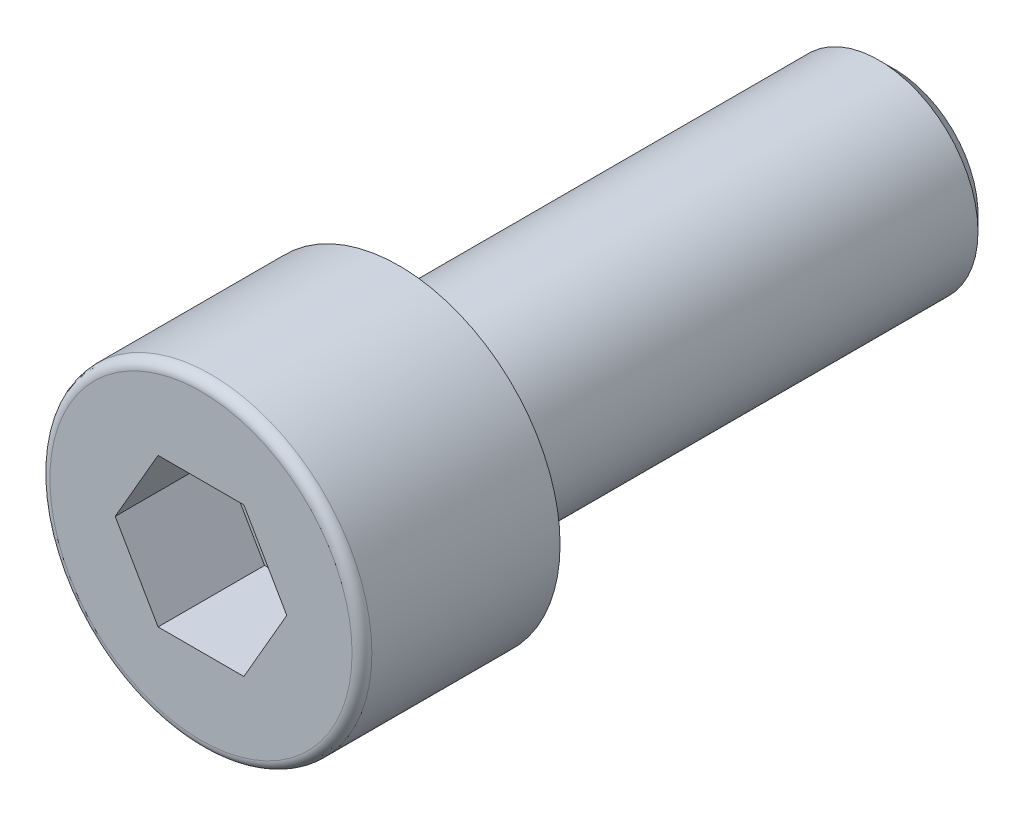
ISO-10303-21;
HEADER;
FILE_DESCRIPTION(('STEP AP214'),'2;1');
FILE_NAME('part.step','',(''),(''),'','','');
FILE_SCHEMA(('AUTOMOTIVE_DESIGN { 1 0 10303 214 1 1 1 1 }'));
ENDSEC;
DATA;
#1=APPLICATION_CONTEXT('core data for automotive mechanical design processes');
#2=APPLICATION_PROTOCOL_DEFINITION('international standard','automotive_design',2000,#1);
#3=PRODUCT_CONTEXT('',#1,'mechanical');
#4=PRODUCT('Part','Part','',(#3));
#5=PRODUCT_RELATED_PRODUCT_CATEGORY('part','',(#4));
#6=PRODUCT_DEFINITION_FORMATION('','',#4);
#7=PRODUCT_DEFINITION_CONTEXT('part definition',#1,'design');
#8=PRODUCT_DEFINITION('design','',#6,#7);
#9=PRODUCT_DEFINITION_SHAPE('','',#8);
#10=(LENGTH_UNIT() NAMED_UNIT(*) SI_UNIT(.MILLI.,.METRE.));
#11=(NAMED_UNIT(*) PLANE_ANGLE_UNIT() SI_UNIT($,.RADIAN.));
#12=(NAMED_UNIT(*) SI_UNIT($,.STERADIAN.) SOLID_ANGLE_UNIT());
#13=UNCERTAINTY_MEASURE_WITH_UNIT(LENGTH_MEASURE(1.E-05),#10,'distance_accuracy_value','');
#14=(GEOMETRIC_REPRESENTATION_CONTEXT(3) GLOBAL_UNCERTAINTY_ASSIGNED_CONTEXT((#13)) GLOBAL_UNIT_ASSIGNED_CONTEXT((#10,
#11,#12)) REPRESENTATION_CONTEXT('',''));
#15=CARTESIAN_POINT('',(0.,0.,0.));
#16=DIRECTION('',(0.,0.,1.));
#17=DIRECTION('',(1.,0.,0.));
#18=AXIS2_PLACEMENT_3D('',#15,#16,#17);
#19=CARTESIAN_POINT('',(0.,0.,-20.));
#20=DIRECTION('',(0.,0.,-1.));
#21=DIRECTION('',(-1.,0.,0.));
#22=AXIS2_PLACEMENT_3D('',#19,#20,#21);
#23=PLANE('',#22);
#24=CARTESIAN_POINT('',(0.,0.,-20.));
#25=DIRECTION('',(0.,0.,-1.));
#26=DIRECTION('',(-1.,0.,0.));
#27=AXIS2_PLACEMENT_3D('',#24,#25,#26);
#28=CIRCLE('',#27,3.375);
#29=CARTESIAN_POINT('',(-3.37499999999999,0.,-20.));
#30=VERTEX_POINT('',#29);
#31=EDGE_CURVE('E11',#30,#30,#28,.T.);
#32=ORIENTED_EDGE('',*,*,#31,.T.);
#33=EDGE_LOOP('',(#32));
#34=FACE_BOUND('',#33,.T.);
#35=ADVANCED_FACE('F47',(#34),#23,.T.);
#36=CARTESIAN_POINT('',(0.,0.,8.));
#37=DIRECTION('',(0.,0.,1.));
#38=DIRECTION('',(1.,0.,0.));
#39=AXIS2_PLACEMENT_3D('',#36,#37,#38);
#40=CYLINDRICAL_SURFACE('',#39,3.99999999999999);
#41=CARTESIAN_POINT('',(0.,0.,-19.375));
#42=DIRECTION('',(0.,0.,-1.));
#43=DIRECTION('',(-1.,0.,0.));
#44=AXIS2_PLACEMENT_3D('',#41,#42,#43);
#45=CIRCLE('',#44,3.99999999999999);
#46=CARTESIAN_POINT('',(-3.99999999999999,0.,-19.375));
#47=VERTEX_POINT('',#46);
#48=EDGE_CURVE('E55',#47,#47,#45,.F.);
#49=ORIENTED_EDGE('',*,*,#48,.T.);
#50=EDGE_LOOP('',(#49));
#51=FACE_BOUND('',#50,.T.);
#52=CARTESIAN_POINT('',(0.,0.,0.));
#53=DIRECTION('',(0.,0.,1.));
#54=DIRECTION('',(1.,0.,0.));
#55=AXIS2_PLACEMENT_3D('',#52,#53,#54);
#56=CIRCLE('',#55,3.99999999999999);
#57=CARTESIAN_POINT('',(4.,0.,0.));
#58=VERTEX_POINT('',#57);
#59=EDGE_CURVE('E163',#58,#58,#56,.T.);
#60=ORIENTED_EDGE('',*,*,#59,.F.);
#61=EDGE_LOOP('',(#60));
#62=FACE_BOUND('',#61,.T.);
#63=ADVANCED_FACE('F168',(#51,#62),#40,.T.);
#64=CARTESIAN_POINT('',(4.,0.,0.));
#65=DIRECTION('',(0.,0.,-1.));
#66=DIRECTION('',(-1.,0.,0.));
#67=AXIS2_PLACEMENT_3D('',#64,#65,#66);
#68=PLANE('',#67);
#69=ORIENTED_EDGE('',*,*,#59,.T.);
#70=EDGE_LOOP('',(#69));
#71=FACE_BOUND('',#70,.T.);
#72=CARTESIAN_POINT('',(0.,0.,0.));
#73=DIRECTION('',(0.,0.,1.));
#74=DIRECTION('',(1.,0.,0.));
#75=AXIS2_PLACEMENT_3D('',#72,#73,#74);
#76=CIRCLE('',#75,6.5);
#77=CARTESIAN_POINT('',(6.5,0.,0.));
#78=VERTEX_POINT('',#77);
#79=EDGE_CURVE('E160',#78,#78,#76,.T.);
#80=ORIENTED_EDGE('',*,*,#79,.F.);
#81=EDGE_LOOP('',(#80));
#82=FACE_BOUND('',#81,.T.);
#83=ADVANCED_FACE('F185',(#71,#82),#68,.T.);
#84=CARTESIAN_POINT('',(0.,0.,8.));
#85=DIRECTION('',(0.,0.,1.));
#86=DIRECTION('',(1.,0.,0.));
#87=AXIS2_PLACEMENT_3D('',#84,#85,#86);
#88=CYLINDRICAL_SURFACE('',#87,6.5);
#89=ORIENTED_EDGE('',*,*,#79,.T.);
#90=EDGE_LOOP('',(#89));
#91=FACE_BOUND('',#90,.T.);
#92=CARTESIAN_POINT('',(0.,0.,7.6));
#93=DIRECTION('',(0.,0.,1.));
#94=DIRECTION('',(1.,0.,0.));
#95=AXIS2_PLACEMENT_3D('',#92,#93,#94);
#96=CIRCLE('',#95,6.5);
#97=CARTESIAN_POINT('',(6.5,0.,7.6));
#98=VERTEX_POINT('',#97);
#99=EDGE_CURVE('E157',#98,#98,#96,.T.);
#100=ORIENTED_EDGE('',*,*,#99,.F.);
#101=EDGE_LOOP('',(#100));
#102=FACE_BOUND('',#101,.T.);
#103=ADVANCED_FACE('F190',(#91,#102),#88,.T.);
#104=CARTESIAN_POINT('',(0.,0.,7.6));
#105=DIRECTION('',(0.,0.,1.));
#106=DIRECTION('',(1.,0.,0.));
#107=AXIS2_PLACEMENT_3D('',#104,#105,#106);
#108=TOROIDAL_SURFACE('',#107,6.1,0.4);
#109=ORIENTED_EDGE('',*,*,#99,.T.);
#110=EDGE_LOOP('',(#109));
#111=FACE_BOUND('',#110,.T.);
#112=CARTESIAN_POINT('',(0.,0.,8.));
#113=DIRECTION('',(0.,0.,1.));
#114=DIRECTION('',(1.,0.,0.));
#115=AXIS2_PLACEMENT_3D('',#112,#113,#114);
#116=CIRCLE('',#115,6.1);
#117=CARTESIAN_POINT('',(6.1,0.,8.));
#118=VERTEX_POINT('',#117);
#119=EDGE_CURVE('E149',#118,#118,#116,.T.);
#120=ORIENTED_EDGE('',*,*,#119,.F.);
#121=EDGE_LOOP('',(#120));
#122=FACE_BOUND('',#121,.T.);
#123=ADVANCED_FACE('F194',(#111,#122),#108,.T.);
#124=CARTESIAN_POINT('',(6.1,0.,8.));
#125=DIRECTION('',(0.,0.,1.));
#126=DIRECTION('',(1.,0.,0.));
#127=AXIS2_PLACEMENT_3D('',#124,#125,#126);
#128=PLANE('',#127);
#129=DIRECTION('',(0.499999999999999,0.866025403784439,0.));
#130=VECTOR('',#129,1.);
#131=CARTESIAN_POINT('',(1.73205080756888,-3.,8.));
#132=LINE('',#131,#130);
#133=CARTESIAN_POINT('',(1.73205080756888,-3.,8.));
#134=VERTEX_POINT('',#133);
#135=CARTESIAN_POINT('',(3.46410161513775,0.,8.));
#136=VERTEX_POINT('',#135);
#137=EDGE_CURVE('E62',#134,#136,#132,.T.);
#138=ORIENTED_EDGE('',*,*,#137,.F.);
#139=DIRECTION('',(1.,0.,0.));
#140=VECTOR('',#139,1.);
#141=CARTESIAN_POINT('',(-1.73205080756888,-3.,8.));
#142=LINE('',#141,#140);
#143=CARTESIAN_POINT('',(-1.73205080756888,-3.,8.));
#144=VERTEX_POINT('',#143);
#145=EDGE_CURVE('E145',#144,#134,#142,.T.);
#146=ORIENTED_EDGE('',*,*,#145,.F.);
#147=DIRECTION('',(0.5,-0.866025403784438,0.));
#148=VECTOR('',#147,1.);
#149=CARTESIAN_POINT('',(-3.46410161513775,0.,8.));
#150=LINE('',#149,#148);
#151=CARTESIAN_POINT('',(-3.46410161513775,0.,8.));
#152=VERTEX_POINT('',#151);
#153=EDGE_CURVE('E143',#152,#144,#150,.T.);
#154=ORIENTED_EDGE('',*,*,#153,.F.);
#155=DIRECTION('',(-0.5,-0.866025403784439,0.));
#156=VECTOR('',#155,1.);
#157=CARTESIAN_POINT('',(-1.73205080756888,3.,8.));
#158=LINE('',#157,#156);
#159=CARTESIAN_POINT('',(-1.73205080756888,3.,8.));
#160=VERTEX_POINT('',#159);
#161=EDGE_CURVE('E110',#160,#152,#158,.T.);
#162=ORIENTED_EDGE('',*,*,#161,.F.);
#163=DIRECTION('',(-1.,0.,0.));
#164=VECTOR('',#163,1.);
#165=CARTESIAN_POINT('',(1.73205080756888,3.,8.));
#166=LINE('',#165,#164);
#167=CARTESIAN_POINT('',(1.73205080756888,3.,8.));
#168=VERTEX_POINT('',#167);
#169=EDGE_CURVE('E139',#168,#160,#166,.T.);
#170=ORIENTED_EDGE('',*,*,#169,.F.);
#171=DIRECTION('',(-0.5,0.866025403784439,0.));
#172=VECTOR('',#171,1.);
#173=CARTESIAN_POINT('',(3.46410161513775,0.,8.));
#174=LINE('',#173,#172);
#175=EDGE_CURVE('E136',#136,#168,#174,.T.);
#176=ORIENTED_EDGE('',*,*,#175,.F.);
#177=EDGE_LOOP('',(#138,#146,#154,#162,#170,#176));
#178=FACE_BOUND('',#177,.T.);
#179=ORIENTED_EDGE('',*,*,#119,.T.);
#180=EDGE_LOOP('',(#179));
#181=FACE_BOUND('',#180,.T.);
#182=ADVANCED_FACE('F198',(#178,#181),#128,.T.);
#183=CARTESIAN_POINT('',(1.73205080756888,-3.,3.7));
#184=DIRECTION('',(0.866025403784439,-0.499999999999999,0.));
#185=DIRECTION('',(0.499999999999999,0.866025403784439,0.));
#186=AXIS2_PLACEMENT_3D('',#183,#184,#185);
#187=PLANE('',#186);
#188=ORIENTED_EDGE('',*,*,#137,.T.);
#189=DIRECTION('',(0.,0.,1.));
#190=VECTOR('',#189,1.);
#191=CARTESIAN_POINT('',(3.46410161513775,0.,3.7));
#192=LINE('',#191,#190);
#193=CARTESIAN_POINT('',(3.46410161513775,0.,3.7));
#194=VERTEX_POINT('',#193);
#195=EDGE_CURVE('E92',#194,#136,#192,.T.);
#196=ORIENTED_EDGE('',*,*,#195,.F.);
#197=DIRECTION('',(0.499999999999999,0.866025403784439,0.));
#198=VECTOR('',#197,1.);
#199=CARTESIAN_POINT('',(1.73205080756888,-3.,3.7));
#200=LINE('',#199,#198);
#201=CARTESIAN_POINT('',(1.73205080756888,-3.,3.7));
#202=VERTEX_POINT('',#201);
#203=EDGE_CURVE('E147',#202,#194,#200,.T.);
#204=ORIENTED_EDGE('',*,*,#203,.F.);
#205=DIRECTION('',(0.,0.,1.));
#206=VECTOR('',#205,1.);
#207=CARTESIAN_POINT('',(1.73205080756888,-3.,3.7));
#208=LINE('',#207,#206);
#209=EDGE_CURVE('E70',#202,#134,#208,.T.);
#210=ORIENTED_EDGE('',*,*,#209,.T.);
#211=EDGE_LOOP('',(#188,#196,#204,#210));
#212=FACE_BOUND('',#211,.T.);
#213=ADVANCED_FACE('F202',(#212),#187,.F.);
#214=CARTESIAN_POINT('',(-1.73205080756888,-3.,3.7));
#215=DIRECTION('',(0.,-1.,0.));
#216=DIRECTION('',(1.,0.,0.));
#217=AXIS2_PLACEMENT_3D('',#214,#215,#216);
#218=PLANE('',#217);
#219=ORIENTED_EDGE('',*,*,#145,.T.);
#220=ORIENTED_EDGE('',*,*,#209,.F.);
#221=DIRECTION('',(1.,0.,0.));
#222=VECTOR('',#221,1.);
#223=CARTESIAN_POINT('',(-1.73205080756888,-3.,3.7));
#224=LINE('',#223,#222);
#225=CARTESIAN_POINT('',(-1.73205080756888,-3.,3.7));
#226=VERTEX_POINT('',#225);
#227=EDGE_CURVE('E122',#226,#202,#224,.T.);
#228=ORIENTED_EDGE('',*,*,#227,.F.);
#229=DIRECTION('',(0.,0.,1.));
#230=VECTOR('',#229,1.);
#231=CARTESIAN_POINT('',(-1.73205080756888,-3.,3.7));
#232=LINE('',#231,#230);
#233=EDGE_CURVE('E114',#226,#144,#232,.T.);
#234=ORIENTED_EDGE('',*,*,#233,.T.);
#235=EDGE_LOOP('',(#219,#220,#228,#234));
#236=FACE_BOUND('',#235,.T.);
#237=ADVANCED_FACE('F206',(#236),#218,.F.);
#238=CARTESIAN_POINT('',(-3.46410161513775,0.,3.7));
#239=DIRECTION('',(-0.866025403784438,-0.5,0.));
#240=DIRECTION('',(0.5,-0.866025403784439,0.));
#241=AXIS2_PLACEMENT_3D('',#238,#239,#240);
#242=PLANE('',#241);
#243=ORIENTED_EDGE('',*,*,#153,.T.);
#244=ORIENTED_EDGE('',*,*,#233,.F.);
#245=DIRECTION('',(0.5,-0.866025403784438,0.));
#246=VECTOR('',#245,1.);
#247=CARTESIAN_POINT('',(-3.46410161513775,0.,3.7));
#248=LINE('',#247,#246);
#249=CARTESIAN_POINT('',(-3.46410161513775,0.,3.7));
#250=VERTEX_POINT('',#249);
#251=EDGE_CURVE('E118',#250,#226,#248,.T.);
#252=ORIENTED_EDGE('',*,*,#251,.F.);
#253=DIRECTION('',(0.,0.,1.));
#254=VECTOR('',#253,1.);
#255=CARTESIAN_POINT('',(-3.46410161513775,0.,3.7));
#256=LINE('',#255,#254);
#257=EDGE_CURVE('E103',#250,#152,#256,.T.);
#258=ORIENTED_EDGE('',*,*,#257,.T.);
#259=EDGE_LOOP('',(#243,#244,#252,#258));
#260=FACE_BOUND('',#259,.T.);
#261=ADVANCED_FACE('F119',(#260),#242,.F.);
#262=CARTESIAN_POINT('',(-1.73205080756888,3.,3.7));
#263=DIRECTION('',(-0.866025403784439,0.5,0.));
#264=DIRECTION('',(-0.5,-0.866025403784439,0.));
#265=AXIS2_PLACEMENT_3D('',#262,#263,#264);
#266=PLANE('',#265);
#267=ORIENTED_EDGE('',*,*,#161,.T.);
#268=ORIENTED_EDGE('',*,*,#257,.F.);
#269=DIRECTION('',(-0.5,-0.866025403784439,0.));
#270=VECTOR('',#269,1.);
#271=CARTESIAN_POINT('',(-1.73205080756888,3.,3.7));
#272=LINE('',#271,#270);
#273=CARTESIAN_POINT('',(-1.73205080756888,3.,3.7));
#274=VERTEX_POINT('',#273);
#275=EDGE_CURVE('E107',#274,#250,#272,.T.);
#276=ORIENTED_EDGE('',*,*,#275,.F.);
#277=DIRECTION('',(0.,0.,1.));
#278=VECTOR('',#277,1.);
#279=CARTESIAN_POINT('',(-1.73205080756888,3.,3.7));
#280=LINE('',#279,#278);
#281=EDGE_CURVE('E115',#274,#160,#280,.T.);
#282=ORIENTED_EDGE('',*,*,#281,.T.);
#283=EDGE_LOOP('',(#267,#268,#276,#282));
#284=FACE_BOUND('',#283,.T.);
#285=ADVANCED_FACE('F105',(#284),#266,.F.);
#286=CARTESIAN_POINT('',(1.73205080756888,3.,3.7));
#287=DIRECTION('',(0.,1.,0.));
#288=DIRECTION('',(-1.,0.,0.));
#289=AXIS2_PLACEMENT_3D('',#286,#287,#288);
#290=PLANE('',#289);
#291=ORIENTED_EDGE('',*,*,#169,.T.);
#292=ORIENTED_EDGE('',*,*,#281,.F.);
#293=DIRECTION('',(-1.,0.,0.));
#294=VECTOR('',#293,1.);
#295=CARTESIAN_POINT('',(1.73205080756888,3.,3.7));
#296=LINE('',#295,#294);
#297=CARTESIAN_POINT('',(1.73205080756888,3.,3.7));
#298=VERTEX_POINT('',#297);
#299=EDGE_CURVE('E128',#298,#274,#296,.T.);
#300=ORIENTED_EDGE('',*,*,#299,.F.);
#301=DIRECTION('',(0.,0.,1.));
#302=VECTOR('',#301,1.);
#303=CARTESIAN_POINT('',(1.73205080756888,3.,3.7));
#304=LINE('',#303,#302);
#305=EDGE_CURVE('E152',#298,#168,#304,.T.);
#306=ORIENTED_EDGE('',*,*,#305,.T.);
#307=EDGE_LOOP('',(#291,#292,#300,#306));
#308=FACE_BOUND('',#307,.T.);
#309=ADVANCED_FACE('F209',(#308),#290,.F.);
#310=CARTESIAN_POINT('',(3.46410161513775,0.,3.7));
#311=DIRECTION('',(0.866025403784438,0.5,0.));
#312=DIRECTION('',(-0.5,0.866025403784439,0.));
#313=AXIS2_PLACEMENT_3D('',#310,#311,#312);
#314=PLANE('',#313);
#315=ORIENTED_EDGE('',*,*,#175,.T.);
#316=ORIENTED_EDGE('',*,*,#305,.F.);
#317=DIRECTION('',(-0.5,0.866025403784439,0.));
#318=VECTOR('',#317,1.);
#319=CARTESIAN_POINT('',(3.46410161513775,0.,3.7));
#320=LINE('',#319,#318);
#321=EDGE_CURVE('E130',#194,#298,#320,.T.);
#322=ORIENTED_EDGE('',*,*,#321,.F.);
#323=ORIENTED_EDGE('',*,*,#195,.T.);
#324=EDGE_LOOP('',(#315,#316,#322,#323));
#325=FACE_BOUND('',#324,.T.);
#326=ADVANCED_FACE('F177',(#325),#314,.F.);
#327=CARTESIAN_POINT('',(3.46410161513775,0.,3.7));
#328=DIRECTION('',(0.,0.,1.));
#329=DIRECTION('',(1.,0.,0.));
#330=AXIS2_PLACEMENT_3D('',#327,#328,#329);
#331=PLANE('',#330);
#332=ORIENTED_EDGE('',*,*,#203,.T.);
#333=ORIENTED_EDGE('',*,*,#321,.T.);
#334=ORIENTED_EDGE('',*,*,#299,.T.);
#335=ORIENTED_EDGE('',*,*,#275,.T.);
#336=ORIENTED_EDGE('',*,*,#251,.T.);
#337=ORIENTED_EDGE('',*,*,#227,.T.);
#338=EDGE_LOOP('',(#332,#333,#334,#335,#336,#337));
#339=FACE_BOUND('',#338,.T.);
#340=ADVANCED_FACE('F125',(#339),#331,.T.);
#341=CARTESIAN_POINT('',(0.,0.,-19.375));
#342=DIRECTION('',(0.,0.,1.));
#343=DIRECTION('',(1.,0.,0.));
#344=AXIS2_PLACEMENT_3D('',#341,#342,#343);
#345=CONICAL_SURFACE('',#344,3.99999999999999,0.78539816339745);
#346=ORIENTED_EDGE('',*,*,#31,.F.);
#347=EDGE_LOOP('',(#346));
#348=FACE_BOUND('',#347,.T.);
#349=ORIENTED_EDGE('',*,*,#48,.F.);
#350=EDGE_LOOP('',(#349));
#351=FACE_BOUND('',#350,.T.);
#352=ADVANCED_FACE('F49',(#348,#351),#345,.T.);
#353=CLOSED_SHELL('',(#35,#63,#83,#103,#123,#182,#213,#237,#261,#285,#309,#326,#340,#352));
#354=MANIFOLD_SOLID_BREP('B2',#353);
#355=ADVANCED_BREP_SHAPE_REPRESENTATION('',(#18,#354),#14);
#356=SHAPE_DEFINITION_REPRESENTATION(#9,#355);
ENDSEC;
END-ISO-10303-21;
